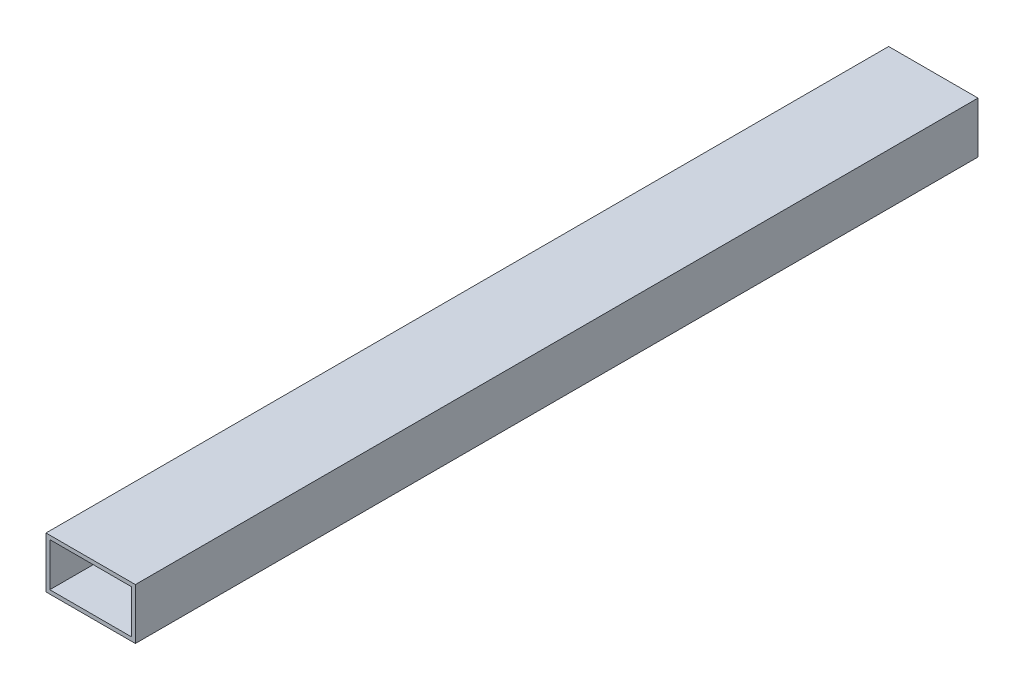
ISO-10303-21;
HEADER;
FILE_DESCRIPTION(('STEP AP214'),'2;1');
FILE_NAME('part.step','',(''),(''),'','','');
FILE_SCHEMA(('AUTOMOTIVE_DESIGN { 1 0 10303 214 1 1 1 1 }'));
ENDSEC;
DATA;
#1=APPLICATION_CONTEXT('core data for automotive mechanical design processes');
#2=APPLICATION_PROTOCOL_DEFINITION('international standard','automotive_design',2000,#1);
#3=PRODUCT_CONTEXT('',#1,'mechanical');
#4=PRODUCT('Part','Part','',(#3));
#5=PRODUCT_RELATED_PRODUCT_CATEGORY('part','',(#4));
#6=PRODUCT_DEFINITION_FORMATION('','',#4);
#7=PRODUCT_DEFINITION_CONTEXT('part definition',#1,'design');
#8=PRODUCT_DEFINITION('design','',#6,#7);
#9=PRODUCT_DEFINITION_SHAPE('','',#8);
#10=(LENGTH_UNIT() NAMED_UNIT(*) SI_UNIT(.MILLI.,.METRE.));
#11=(NAMED_UNIT(*) PLANE_ANGLE_UNIT() SI_UNIT($,.RADIAN.));
#12=(NAMED_UNIT(*) SI_UNIT($,.STERADIAN.) SOLID_ANGLE_UNIT());
#13=UNCERTAINTY_MEASURE_WITH_UNIT(LENGTH_MEASURE(1.E-05),#10,'distance_accuracy_value','');
#14=(GEOMETRIC_REPRESENTATION_CONTEXT(3) GLOBAL_UNCERTAINTY_ASSIGNED_CONTEXT((#13)) GLOBAL_UNIT_ASSIGNED_CONTEXT((#10,
#11,#12)) REPRESENTATION_CONTEXT('',''));
#15=CARTESIAN_POINT('',(0.,0.,0.));
#16=DIRECTION('',(0.,0.,1.));
#17=DIRECTION('',(1.,0.,0.));
#18=AXIS2_PLACEMENT_3D('',#15,#16,#17);
#19=CARTESIAN_POINT('',(0.,0.,330.));
#20=DIRECTION('',(0.,0.,-1.));
#21=DIRECTION('',(-1.,0.,0.));
#22=AXIS2_PLACEMENT_3D('',#19,#20,#21);
#23=PLANE('',#22);
#24=DIRECTION('',(0.,-1.,0.));
#25=VECTOR('',#24,1.);
#26=CARTESIAN_POINT('',(0.,0.,330.));
#27=LINE('',#26,#25);
#28=CARTESIAN_POINT('',(0.,20.,330.));
#29=VERTEX_POINT('',#28);
#30=CARTESIAN_POINT('',(0.,0.,330.));
#31=VERTEX_POINT('',#30);
#32=EDGE_CURVE('E134',#29,#31,#27,.T.);
#33=ORIENTED_EDGE('',*,*,#32,.T.);
#34=DIRECTION('',(1.,0.,0.));
#35=VECTOR('',#34,1.);
#36=CARTESIAN_POINT('',(0.,0.,330.));
#37=LINE('',#36,#35);
#38=CARTESIAN_POINT('',(35.,0.,330.));
#39=VERTEX_POINT('',#38);
#40=EDGE_CURVE('E137',#31,#39,#37,.T.);
#41=ORIENTED_EDGE('',*,*,#40,.T.);
#42=DIRECTION('',(0.,1.,0.));
#43=VECTOR('',#42,1.);
#44=CARTESIAN_POINT('',(35.,0.,330.));
#45=LINE('',#44,#43);
#46=CARTESIAN_POINT('',(35.,20.,330.));
#47=VERTEX_POINT('',#46);
#48=EDGE_CURVE('E140',#39,#47,#45,.T.);
#49=ORIENTED_EDGE('',*,*,#48,.T.);
#50=DIRECTION('',(-1.,0.,0.));
#51=VECTOR('',#50,1.);
#52=CARTESIAN_POINT('',(0.,20.,330.));
#53=LINE('',#52,#51);
#54=EDGE_CURVE('E142',#47,#29,#53,.T.);
#55=ORIENTED_EDGE('',*,*,#54,.T.);
#56=EDGE_LOOP('',(#33,#41,#49,#55));
#57=FACE_BOUND('',#56,.T.);
#58=DIRECTION('',(0.,-1.,0.));
#59=VECTOR('',#58,1.);
#60=CARTESIAN_POINT('',(1.5,18.5,330.));
#61=LINE('',#60,#59);
#62=CARTESIAN_POINT('',(1.5,18.5,330.));
#63=VERTEX_POINT('',#62);
#64=CARTESIAN_POINT('',(1.5,1.5,330.));
#65=VERTEX_POINT('',#64);
#66=EDGE_CURVE('E98',#63,#65,#61,.T.);
#67=ORIENTED_EDGE('',*,*,#66,.F.);
#68=DIRECTION('',(-1.,0.,0.));
#69=VECTOR('',#68,1.);
#70=CARTESIAN_POINT('',(1.5,18.5,330.));
#71=LINE('',#70,#69);
#72=CARTESIAN_POINT('',(33.5,18.5,330.));
#73=VERTEX_POINT('',#72);
#74=EDGE_CURVE('E120',#73,#63,#71,.T.);
#75=ORIENTED_EDGE('',*,*,#74,.F.);
#76=DIRECTION('',(0.,1.,0.));
#77=VECTOR('',#76,1.);
#78=CARTESIAN_POINT('',(33.5,18.5,330.));
#79=LINE('',#78,#77);
#80=CARTESIAN_POINT('',(33.5,1.5,330.));
#81=VERTEX_POINT('',#80);
#82=EDGE_CURVE('E118',#81,#73,#79,.T.);
#83=ORIENTED_EDGE('',*,*,#82,.F.);
#84=DIRECTION('',(1.,0.,0.));
#85=VECTOR('',#84,1.);
#86=CARTESIAN_POINT('',(1.5,1.5,330.));
#87=LINE('',#86,#85);
#88=EDGE_CURVE('E106',#65,#81,#87,.T.);
#89=ORIENTED_EDGE('',*,*,#88,.F.);
#90=EDGE_LOOP('',(#67,#75,#83,#89));
#91=FACE_BOUND('',#90,.T.);
#92=ADVANCED_FACE('F33',(#57,#91),#23,.F.);
#93=CARTESIAN_POINT('',(0.,0.,0.));
#94=DIRECTION('',(0.,0.,-1.));
#95=DIRECTION('',(-1.,0.,0.));
#96=AXIS2_PLACEMENT_3D('',#93,#94,#95);
#97=PLANE('',#96);
#98=DIRECTION('',(0.,-1.,0.));
#99=VECTOR('',#98,1.);
#100=CARTESIAN_POINT('',(0.,0.,0.));
#101=LINE('',#100,#99);
#102=CARTESIAN_POINT('',(0.,20.,0.));
#103=VERTEX_POINT('',#102);
#104=CARTESIAN_POINT('',(0.,0.,0.));
#105=VERTEX_POINT('',#104);
#106=EDGE_CURVE('E114',#103,#105,#101,.T.);
#107=ORIENTED_EDGE('',*,*,#106,.F.);
#108=DIRECTION('',(-1.,0.,0.));
#109=VECTOR('',#108,1.);
#110=CARTESIAN_POINT('',(0.,20.,0.));
#111=LINE('',#110,#109);
#112=CARTESIAN_POINT('',(35.,20.,0.));
#113=VERTEX_POINT('',#112);
#114=EDGE_CURVE('E138',#113,#103,#111,.T.);
#115=ORIENTED_EDGE('',*,*,#114,.F.);
#116=DIRECTION('',(0.,1.,0.));
#117=VECTOR('',#116,1.);
#118=CARTESIAN_POINT('',(35.,0.,0.));
#119=LINE('',#118,#117);
#120=CARTESIAN_POINT('',(35.,0.,0.));
#121=VERTEX_POINT('',#120);
#122=EDGE_CURVE('E149',#121,#113,#119,.T.);
#123=ORIENTED_EDGE('',*,*,#122,.F.);
#124=DIRECTION('',(1.,0.,0.));
#125=VECTOR('',#124,1.);
#126=CARTESIAN_POINT('',(0.,0.,0.));
#127=LINE('',#126,#125);
#128=EDGE_CURVE('E147',#105,#121,#127,.T.);
#129=ORIENTED_EDGE('',*,*,#128,.F.);
#130=EDGE_LOOP('',(#107,#115,#123,#129));
#131=FACE_BOUND('',#130,.T.);
#132=DIRECTION('',(-1.,0.,0.));
#133=VECTOR('',#132,1.);
#134=CARTESIAN_POINT('',(1.5,18.5,0.));
#135=LINE('',#134,#133);
#136=CARTESIAN_POINT('',(33.5,18.5,0.));
#137=VERTEX_POINT('',#136);
#138=CARTESIAN_POINT('',(1.5,18.5,0.));
#139=VERTEX_POINT('',#138);
#140=EDGE_CURVE('E107',#137,#139,#135,.T.);
#141=ORIENTED_EDGE('',*,*,#140,.T.);
#142=DIRECTION('',(0.,-1.,0.));
#143=VECTOR('',#142,1.);
#144=CARTESIAN_POINT('',(1.5,18.5,0.));
#145=LINE('',#144,#143);
#146=CARTESIAN_POINT('',(1.5,1.5,0.));
#147=VERTEX_POINT('',#146);
#148=EDGE_CURVE('E56',#139,#147,#145,.T.);
#149=ORIENTED_EDGE('',*,*,#148,.T.);
#150=DIRECTION('',(1.,0.,0.));
#151=VECTOR('',#150,1.);
#152=CARTESIAN_POINT('',(1.5,1.5,0.));
#153=LINE('',#152,#151);
#154=CARTESIAN_POINT('',(33.5,1.5,0.));
#155=VERTEX_POINT('',#154);
#156=EDGE_CURVE('E113',#147,#155,#153,.T.);
#157=ORIENTED_EDGE('',*,*,#156,.T.);
#158=DIRECTION('',(0.,1.,0.));
#159=VECTOR('',#158,1.);
#160=CARTESIAN_POINT('',(33.5,18.5,0.));
#161=LINE('',#160,#159);
#162=EDGE_CURVE('E126',#155,#137,#161,.T.);
#163=ORIENTED_EDGE('',*,*,#162,.T.);
#164=EDGE_LOOP('',(#141,#149,#157,#163));
#165=FACE_BOUND('',#164,.T.);
#166=ADVANCED_FACE('F167',(#131,#165),#97,.T.);
#167=CARTESIAN_POINT('',(0.,0.,330.));
#168=DIRECTION('',(1.,0.,0.));
#169=DIRECTION('',(0.,1.,0.));
#170=AXIS2_PLACEMENT_3D('',#167,#168,#169);
#171=PLANE('',#170);
#172=ORIENTED_EDGE('',*,*,#106,.T.);
#173=DIRECTION('',(0.,0.,-1.));
#174=VECTOR('',#173,1.);
#175=CARTESIAN_POINT('',(0.,0.,330.));
#176=LINE('',#175,#174);
#177=EDGE_CURVE('E11',#31,#105,#176,.T.);
#178=ORIENTED_EDGE('',*,*,#177,.F.);
#179=ORIENTED_EDGE('',*,*,#32,.F.);
#180=DIRECTION('',(0.,0.,-1.));
#181=VECTOR('',#180,1.);
#182=CARTESIAN_POINT('',(0.,20.,330.));
#183=LINE('',#182,#181);
#184=EDGE_CURVE('E144',#29,#103,#183,.T.);
#185=ORIENTED_EDGE('',*,*,#184,.T.);
#186=EDGE_LOOP('',(#172,#178,#179,#185));
#187=FACE_BOUND('',#186,.T.);
#188=ADVANCED_FACE('F35',(#187),#171,.F.);
#189=CARTESIAN_POINT('',(0.,0.,330.));
#190=DIRECTION('',(0.,1.,0.));
#191=DIRECTION('',(0.,0.,1.));
#192=AXIS2_PLACEMENT_3D('',#189,#190,#191);
#193=PLANE('',#192);
#194=ORIENTED_EDGE('',*,*,#128,.T.);
#195=DIRECTION('',(0.,0.,-1.));
#196=VECTOR('',#195,1.);
#197=CARTESIAN_POINT('',(35.,0.,330.));
#198=LINE('',#197,#196);
#199=EDGE_CURVE('E41',#39,#121,#198,.T.);
#200=ORIENTED_EDGE('',*,*,#199,.F.);
#201=ORIENTED_EDGE('',*,*,#40,.F.);
#202=ORIENTED_EDGE('',*,*,#177,.T.);
#203=EDGE_LOOP('',(#194,#200,#201,#202));
#204=FACE_BOUND('',#203,.T.);
#205=ADVANCED_FACE('F177',(#204),#193,.F.);
#206=CARTESIAN_POINT('',(35.,0.,330.));
#207=DIRECTION('',(-1.,0.,0.));
#208=DIRECTION('',(0.,-1.,0.));
#209=AXIS2_PLACEMENT_3D('',#206,#207,#208);
#210=PLANE('',#209);
#211=ORIENTED_EDGE('',*,*,#122,.T.);
#212=DIRECTION('',(0.,0.,-1.));
#213=VECTOR('',#212,1.);
#214=CARTESIAN_POINT('',(35.,20.,330.));
#215=LINE('',#214,#213);
#216=EDGE_CURVE('E154',#47,#113,#215,.T.);
#217=ORIENTED_EDGE('',*,*,#216,.F.);
#218=ORIENTED_EDGE('',*,*,#48,.F.);
#219=ORIENTED_EDGE('',*,*,#199,.T.);
#220=EDGE_LOOP('',(#211,#217,#218,#219));
#221=FACE_BOUND('',#220,.T.);
#222=ADVANCED_FACE('F161',(#221),#210,.F.);
#223=CARTESIAN_POINT('',(0.,20.,330.));
#224=DIRECTION('',(0.,-1.,0.));
#225=DIRECTION('',(0.,0.,-1.));
#226=AXIS2_PLACEMENT_3D('',#223,#224,#225);
#227=PLANE('',#226);
#228=ORIENTED_EDGE('',*,*,#114,.T.);
#229=ORIENTED_EDGE('',*,*,#184,.F.);
#230=ORIENTED_EDGE('',*,*,#54,.F.);
#231=ORIENTED_EDGE('',*,*,#216,.T.);
#232=EDGE_LOOP('',(#228,#229,#230,#231));
#233=FACE_BOUND('',#232,.T.);
#234=ADVANCED_FACE('F171',(#233),#227,.F.);
#235=CARTESIAN_POINT('',(1.5,18.5,330.));
#236=DIRECTION('',(1.,0.,0.));
#237=DIRECTION('',(0.,1.,0.));
#238=AXIS2_PLACEMENT_3D('',#235,#236,#237);
#239=PLANE('',#238);
#240=ORIENTED_EDGE('',*,*,#148,.F.);
#241=DIRECTION('',(0.,0.,-1.));
#242=VECTOR('',#241,1.);
#243=CARTESIAN_POINT('',(1.5,18.5,330.));
#244=LINE('',#243,#242);
#245=EDGE_CURVE('E102',#63,#139,#244,.T.);
#246=ORIENTED_EDGE('',*,*,#245,.F.);
#247=ORIENTED_EDGE('',*,*,#66,.T.);
#248=DIRECTION('',(0.,0.,-1.));
#249=VECTOR('',#248,1.);
#250=CARTESIAN_POINT('',(1.5,1.5,330.));
#251=LINE('',#250,#249);
#252=EDGE_CURVE('E101',#65,#147,#251,.T.);
#253=ORIENTED_EDGE('',*,*,#252,.T.);
#254=EDGE_LOOP('',(#240,#246,#247,#253));
#255=FACE_BOUND('',#254,.T.);
#256=ADVANCED_FACE('F100',(#255),#239,.T.);
#257=CARTESIAN_POINT('',(1.5,1.5,330.));
#258=DIRECTION('',(0.,1.,0.));
#259=DIRECTION('',(0.,0.,1.));
#260=AXIS2_PLACEMENT_3D('',#257,#258,#259);
#261=PLANE('',#260);
#262=ORIENTED_EDGE('',*,*,#156,.F.);
#263=ORIENTED_EDGE('',*,*,#252,.F.);
#264=ORIENTED_EDGE('',*,*,#88,.T.);
#265=DIRECTION('',(0.,0.,-1.));
#266=VECTOR('',#265,1.);
#267=CARTESIAN_POINT('',(33.5,1.5,330.));
#268=LINE('',#267,#266);
#269=EDGE_CURVE('E115',#81,#155,#268,.T.);
#270=ORIENTED_EDGE('',*,*,#269,.T.);
#271=EDGE_LOOP('',(#262,#263,#264,#270));
#272=FACE_BOUND('',#271,.T.);
#273=ADVANCED_FACE('F110',(#272),#261,.T.);
#274=CARTESIAN_POINT('',(33.5,18.5,330.));
#275=DIRECTION('',(-1.,0.,0.));
#276=DIRECTION('',(0.,0.,1.));
#277=AXIS2_PLACEMENT_3D('',#274,#275,#276);
#278=PLANE('',#277);
#279=ORIENTED_EDGE('',*,*,#162,.F.);
#280=ORIENTED_EDGE('',*,*,#269,.F.);
#281=ORIENTED_EDGE('',*,*,#82,.T.);
#282=DIRECTION('',(0.,0.,-1.));
#283=VECTOR('',#282,1.);
#284=CARTESIAN_POINT('',(33.5,18.5,330.));
#285=LINE('',#284,#283);
#286=EDGE_CURVE('E48',#73,#137,#285,.T.);
#287=ORIENTED_EDGE('',*,*,#286,.T.);
#288=EDGE_LOOP('',(#279,#280,#281,#287));
#289=FACE_BOUND('',#288,.T.);
#290=ADVANCED_FACE('F200',(#289),#278,.T.);
#291=CARTESIAN_POINT('',(1.5,18.5,330.));
#292=DIRECTION('',(0.,-1.,0.));
#293=DIRECTION('',(0.,0.,-1.));
#294=AXIS2_PLACEMENT_3D('',#291,#292,#293);
#295=PLANE('',#294);
#296=ORIENTED_EDGE('',*,*,#140,.F.);
#297=ORIENTED_EDGE('',*,*,#286,.F.);
#298=ORIENTED_EDGE('',*,*,#74,.T.);
#299=ORIENTED_EDGE('',*,*,#245,.T.);
#300=EDGE_LOOP('',(#296,#297,#298,#299));
#301=FACE_BOUND('',#300,.T.);
#302=ADVANCED_FACE('F204',(#301),#295,.T.);
#303=CLOSED_SHELL('',(#92,#166,#188,#205,#222,#234,#256,#273,#290,#302));
#304=MANIFOLD_SOLID_BREP('B2',#303);
#305=ADVANCED_BREP_SHAPE_REPRESENTATION('',(#18,#304),#14);
#306=SHAPE_DEFINITION_REPRESENTATION(#9,#305);
ENDSEC;
END-ISO-10303-21;
